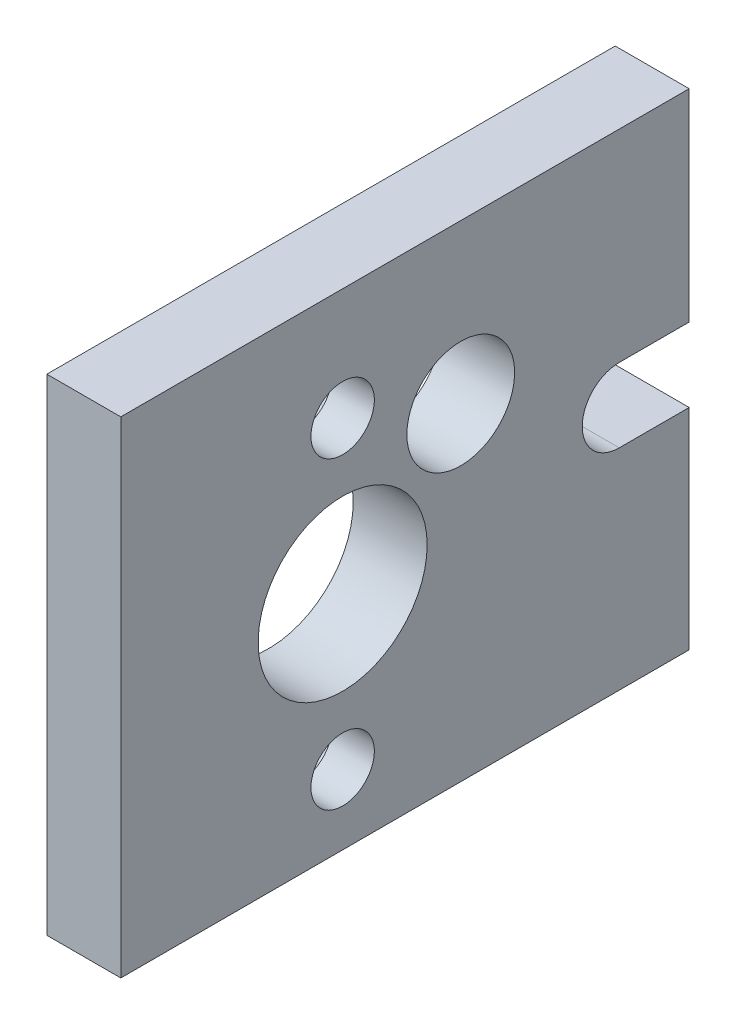
ISO-10303-21;
HEADER;
FILE_DESCRIPTION(('STEP AP214'),'2;1');
FILE_NAME('part.step','',(''),(''),'','','');
FILE_SCHEMA(('AUTOMOTIVE_DESIGN { 1 0 10303 214 1 1 1 1 }'));
ENDSEC;
DATA;
#1=APPLICATION_CONTEXT('core data for automotive mechanical design processes');
#2=APPLICATION_PROTOCOL_DEFINITION('international standard','automotive_design',2000,#1);
#3=PRODUCT_CONTEXT('',#1,'mechanical');
#4=PRODUCT('Part','Part','',(#3));
#5=PRODUCT_RELATED_PRODUCT_CATEGORY('part','',(#4));
#6=PRODUCT_DEFINITION_FORMATION('','',#4);
#7=PRODUCT_DEFINITION_CONTEXT('part definition',#1,'design');
#8=PRODUCT_DEFINITION('design','',#6,#7);
#9=PRODUCT_DEFINITION_SHAPE('','',#8);
#10=(LENGTH_UNIT() NAMED_UNIT(*) SI_UNIT(.MILLI.,.METRE.));
#11=(NAMED_UNIT(*) PLANE_ANGLE_UNIT() SI_UNIT($,.RADIAN.));
#12=(NAMED_UNIT(*) SI_UNIT($,.STERADIAN.) SOLID_ANGLE_UNIT());
#13=UNCERTAINTY_MEASURE_WITH_UNIT(LENGTH_MEASURE(1.E-05),#10,'distance_accuracy_value','');
#14=(GEOMETRIC_REPRESENTATION_CONTEXT(3) GLOBAL_UNCERTAINTY_ASSIGNED_CONTEXT((#13)) GLOBAL_UNIT_ASSIGNED_CONTEXT((#10,
#11,#12)) REPRESENTATION_CONTEXT('',''));
#15=CARTESIAN_POINT('',(0.,0.,0.));
#16=DIRECTION('',(0.,0.,1.));
#17=DIRECTION('',(1.,0.,0.));
#18=AXIS2_PLACEMENT_3D('',#15,#16,#17);
#19=CARTESIAN_POINT('',(3.5,0.,10.5));
#20=DIRECTION('',(0.,0.,1.));
#21=DIRECTION('',(1.,0.,0.));
#22=AXIS2_PLACEMENT_3D('',#19,#20,#21);
#23=PLANE('',#22);
#24=DIRECTION('',(0.,1.,0.));
#25=VECTOR('',#24,1.);
#26=CARTESIAN_POINT('',(0.,0.,10.5));
#27=LINE('',#26,#25);
#28=CARTESIAN_POINT('',(0.,-10.5,10.5));
#29=VERTEX_POINT('',#28);
#30=CARTESIAN_POINT('',(0.,12.5,10.5));
#31=VERTEX_POINT('',#30);
#32=EDGE_CURVE('E127',#29,#31,#27,.T.);
#33=ORIENTED_EDGE('',*,*,#32,.F.);
#34=DIRECTION('',(-1.,0.,0.));
#35=VECTOR('',#34,1.);
#36=CARTESIAN_POINT('',(3.5,-10.5,10.5));
#37=LINE('',#36,#35);
#38=CARTESIAN_POINT('',(3.5,-10.5,10.5));
#39=VERTEX_POINT('',#38);
#40=EDGE_CURVE('E12',#39,#29,#37,.T.);
#41=ORIENTED_EDGE('',*,*,#40,.F.);
#42=DIRECTION('',(0.,1.,0.));
#43=VECTOR('',#42,1.);
#44=CARTESIAN_POINT('',(3.5,0.,10.5));
#45=LINE('',#44,#43);
#46=CARTESIAN_POINT('',(3.5,12.5,10.5));
#47=VERTEX_POINT('',#46);
#48=EDGE_CURVE('E198',#39,#47,#45,.T.);
#49=ORIENTED_EDGE('',*,*,#48,.T.);
#50=DIRECTION('',(-1.,0.,0.));
#51=VECTOR('',#50,1.);
#52=CARTESIAN_POINT('',(30.4742469774413,12.5,10.5));
#53=LINE('',#52,#51);
#54=EDGE_CURVE('E129',#47,#31,#53,.T.);
#55=ORIENTED_EDGE('',*,*,#54,.T.);
#56=EDGE_LOOP('',(#33,#41,#49,#55));
#57=FACE_BOUND('',#56,.T.);
#58=ADVANCED_FACE('F43',(#57),#23,.T.);
#59=CARTESIAN_POINT('',(3.5,-10.5,0.));
#60=DIRECTION('',(0.,-1.,0.));
#61=DIRECTION('',(0.,0.,-1.));
#62=AXIS2_PLACEMENT_3D('',#59,#60,#61);
#63=PLANE('',#62);
#64=DIRECTION('',(0.,0.,1.));
#65=VECTOR('',#64,1.);
#66=CARTESIAN_POINT('',(0.,-10.5,0.));
#67=LINE('',#66,#65);
#68=CARTESIAN_POINT('',(0.,-10.5,-16.4));
#69=VERTEX_POINT('',#68);
#70=EDGE_CURVE('E199',#69,#29,#67,.T.);
#71=ORIENTED_EDGE('',*,*,#70,.F.);
#72=DIRECTION('',(-1.,0.,0.));
#73=VECTOR('',#72,1.);
#74=CARTESIAN_POINT('',(25.3130694768068,-10.5,-16.4));
#75=LINE('',#74,#73);
#76=CARTESIAN_POINT('',(3.5,-10.5,-16.4));
#77=VERTEX_POINT('',#76);
#78=EDGE_CURVE('E148',#77,#69,#75,.T.);
#79=ORIENTED_EDGE('',*,*,#78,.F.);
#80=DIRECTION('',(0.,0.,1.));
#81=VECTOR('',#80,1.);
#82=CARTESIAN_POINT('',(3.5,-10.5,0.));
#83=LINE('',#82,#81);
#84=EDGE_CURVE('E52',#77,#39,#83,.T.);
#85=ORIENTED_EDGE('',*,*,#84,.T.);
#86=ORIENTED_EDGE('',*,*,#40,.T.);
#87=EDGE_LOOP('',(#71,#79,#85,#86));
#88=FACE_BOUND('',#87,.T.);
#89=ADVANCED_FACE('F209',(#88),#63,.T.);
#90=CARTESIAN_POINT('',(3.5,0.,0.));
#91=DIRECTION('',(-1.,0.,0.));
#92=DIRECTION('',(0.,0.,1.));
#93=AXIS2_PLACEMENT_3D('',#90,#91,#92);
#94=CYLINDRICAL_SURFACE('',#93,4.);
#95=CARTESIAN_POINT('',(3.5,0.,0.));
#96=DIRECTION('',(1.,0.,0.));
#97=DIRECTION('',(0.,0.,-1.));
#98=AXIS2_PLACEMENT_3D('',#95,#96,#97);
#99=CIRCLE('',#98,4.);
#100=CARTESIAN_POINT('',(3.5,0.,-4.));
#101=VERTEX_POINT('',#100);
#102=EDGE_CURVE('E195',#101,#101,#99,.T.);
#103=ORIENTED_EDGE('',*,*,#102,.T.);
#104=EDGE_LOOP('',(#103));
#105=FACE_BOUND('',#104,.T.);
#106=CARTESIAN_POINT('',(0.,0.,0.));
#107=DIRECTION('',(1.,0.,0.));
#108=DIRECTION('',(0.,0.,-1.));
#109=AXIS2_PLACEMENT_3D('',#106,#107,#108);
#110=CIRCLE('',#109,4.);
#111=CARTESIAN_POINT('',(0.,0.,-4.));
#112=VERTEX_POINT('',#111);
#113=EDGE_CURVE('E186',#112,#112,#110,.T.);
#114=ORIENTED_EDGE('',*,*,#113,.F.);
#115=EDGE_LOOP('',(#114));
#116=FACE_BOUND('',#115,.T.);
#117=ADVANCED_FACE('F45',(#105,#116),#94,.F.);
#118=CARTESIAN_POINT('',(3.5,0.,0.));
#119=DIRECTION('',(1.,0.,0.));
#120=DIRECTION('',(0.,0.,-1.));
#121=AXIS2_PLACEMENT_3D('',#118,#119,#120);
#122=PLANE('',#121);
#123=CARTESIAN_POINT('',(3.5,5.,-5.59016994374948));
#124=DIRECTION('',(-1.,0.,0.));
#125=DIRECTION('',(0.,0.,1.));
#126=AXIS2_PLACEMENT_3D('',#123,#124,#125);
#127=CIRCLE('',#126,2.55);
#128=CARTESIAN_POINT('',(3.5,5.,-3.04016994374948));
#129=VERTEX_POINT('',#128);
#130=EDGE_CURVE('E165',#129,#129,#127,.T.);
#131=ORIENTED_EDGE('',*,*,#130,.T.);
#132=EDGE_LOOP('',(#131));
#133=FACE_BOUND('',#132,.T.);
#134=CARTESIAN_POINT('',(3.5,-7.2,0.));
#135=DIRECTION('',(-1.,0.,0.));
#136=DIRECTION('',(0.,0.,1.));
#137=AXIS2_PLACEMENT_3D('',#134,#135,#136);
#138=CIRCLE('',#137,1.5);
#139=CARTESIAN_POINT('',(3.5,-7.2,1.5));
#140=VERTEX_POINT('',#139);
#141=EDGE_CURVE('E171',#140,#140,#138,.T.);
#142=ORIENTED_EDGE('',*,*,#141,.T.);
#143=EDGE_LOOP('',(#142));
#144=FACE_BOUND('',#143,.T.);
#145=CARTESIAN_POINT('',(3.5,7.2,0.));
#146=DIRECTION('',(-1.,0.,0.));
#147=DIRECTION('',(0.,0.,1.));
#148=AXIS2_PLACEMENT_3D('',#145,#146,#147);
#149=CIRCLE('',#148,1.5);
#150=CARTESIAN_POINT('',(3.5,7.2,1.5));
#151=VERTEX_POINT('',#150);
#152=EDGE_CURVE('E168',#151,#151,#149,.T.);
#153=ORIENTED_EDGE('',*,*,#152,.T.);
#154=EDGE_LOOP('',(#153));
#155=FACE_BOUND('',#154,.T.);
#156=ORIENTED_EDGE('',*,*,#102,.F.);
#157=EDGE_LOOP('',(#156));
#158=FACE_BOUND('',#157,.T.);
#159=ORIENTED_EDGE('',*,*,#48,.F.);
#160=ORIENTED_EDGE('',*,*,#84,.F.);
#161=DIRECTION('',(0.,-1.,0.));
#162=VECTOR('',#161,1.);
#163=CARTESIAN_POINT('',(3.5,0.,-16.4));
#164=LINE('',#163,#162);
#165=CARTESIAN_POINT('',(3.5,-0.565658985540006,-16.4));
#166=VERTEX_POINT('',#165);
#167=EDGE_CURVE('E145',#166,#77,#164,.T.);
#168=ORIENTED_EDGE('',*,*,#167,.F.);
#169=DIRECTION('',(0.,0.,1.));
#170=VECTOR('',#169,1.);
#171=CARTESIAN_POINT('',(3.5,-0.565658985540002,0.));
#172=LINE('',#171,#170);
#173=CARTESIAN_POINT('',(3.5,-0.565658985540006,-13.0901699437505));
#174=VERTEX_POINT('',#173);
#175=EDGE_CURVE('E134',#166,#174,#172,.T.);
#176=ORIENTED_EDGE('',*,*,#175,.T.);
#177=CARTESIAN_POINT('',(3.5,1.18434101445999,-13.0901699437505));
#178=DIRECTION('',(1.,0.,0.));
#179=DIRECTION('',(0.,0.,-1.));
#180=AXIS2_PLACEMENT_3D('',#177,#178,#179);
#181=CIRCLE('',#180,1.75);
#182=CARTESIAN_POINT('',(3.5,2.93434101445999,-13.0901699437505));
#183=VERTEX_POINT('',#182);
#184=EDGE_CURVE('E153',#174,#183,#181,.F.);
#185=ORIENTED_EDGE('',*,*,#184,.T.);
#186=DIRECTION('',(0.,0.,1.));
#187=VECTOR('',#186,1.);
#188=CARTESIAN_POINT('',(3.5,2.93434101446,0.));
#189=LINE('',#188,#187);
#190=CARTESIAN_POINT('',(3.5,2.93434101445999,-16.4));
#191=VERTEX_POINT('',#190);
#192=EDGE_CURVE('E144',#191,#183,#189,.T.);
#193=ORIENTED_EDGE('',*,*,#192,.F.);
#194=DIRECTION('',(0.,-1.,0.));
#195=VECTOR('',#194,1.);
#196=CARTESIAN_POINT('',(3.5,0.,-16.4));
#197=LINE('',#196,#195);
#198=CARTESIAN_POINT('',(3.5,12.5,-16.4));
#199=VERTEX_POINT('',#198);
#200=EDGE_CURVE('E149',#199,#191,#197,.T.);
#201=ORIENTED_EDGE('',*,*,#200,.F.);
#202=DIRECTION('',(0.,0.,-1.));
#203=VECTOR('',#202,1.);
#204=CARTESIAN_POINT('',(3.5,12.5,-16.4));
#205=LINE('',#204,#203);
#206=EDGE_CURVE('E122',#47,#199,#205,.T.);
#207=ORIENTED_EDGE('',*,*,#206,.F.);
#208=EDGE_LOOP('',(#159,#160,#168,#176,#185,#193,#201,#207));
#209=FACE_BOUND('',#208,.T.);
#210=ADVANCED_FACE('F215',(#133,#144,#155,#158,#209),#122,.T.);
#211=CARTESIAN_POINT('',(0.,0.,0.));
#212=DIRECTION('',(1.,0.,0.));
#213=DIRECTION('',(0.,0.,-1.));
#214=AXIS2_PLACEMENT_3D('',#211,#212,#213);
#215=PLANE('',#214);
#216=CARTESIAN_POINT('',(0.,5.,-5.59016994374948));
#217=DIRECTION('',(-1.,0.,0.));
#218=DIRECTION('',(0.,0.,1.));
#219=AXIS2_PLACEMENT_3D('',#216,#217,#218);
#220=CIRCLE('',#219,2.55);
#221=CARTESIAN_POINT('',(0.,5.,-3.04016994374948));
#222=VERTEX_POINT('',#221);
#223=EDGE_CURVE('E156',#222,#222,#220,.T.);
#224=ORIENTED_EDGE('',*,*,#223,.F.);
#225=EDGE_LOOP('',(#224));
#226=FACE_BOUND('',#225,.T.);
#227=CARTESIAN_POINT('',(0.,7.2,0.));
#228=DIRECTION('',(-1.,0.,0.));
#229=DIRECTION('',(0.,0.,1.));
#230=AXIS2_PLACEMENT_3D('',#227,#228,#229);
#231=CIRCLE('',#230,2.25);
#232=CARTESIAN_POINT('',(0.,7.2,2.25));
#233=VERTEX_POINT('',#232);
#234=EDGE_CURVE('E183',#233,#233,#231,.T.);
#235=ORIENTED_EDGE('',*,*,#234,.F.);
#236=EDGE_LOOP('',(#235));
#237=FACE_BOUND('',#236,.T.);
#238=CARTESIAN_POINT('',(0.,-7.2,0.));
#239=DIRECTION('',(-1.,0.,0.));
#240=DIRECTION('',(0.,0.,1.));
#241=AXIS2_PLACEMENT_3D('',#238,#239,#240);
#242=CIRCLE('',#241,2.25);
#243=CARTESIAN_POINT('',(0.,-7.2,2.25));
#244=VERTEX_POINT('',#243);
#245=EDGE_CURVE('E182',#244,#244,#242,.T.);
#246=ORIENTED_EDGE('',*,*,#245,.F.);
#247=EDGE_LOOP('',(#246));
#248=FACE_BOUND('',#247,.T.);
#249=ORIENTED_EDGE('',*,*,#113,.T.);
#250=EDGE_LOOP('',(#249));
#251=FACE_BOUND('',#250,.T.);
#252=ORIENTED_EDGE('',*,*,#32,.T.);
#253=DIRECTION('',(0.,0.,-1.));
#254=VECTOR('',#253,1.);
#255=CARTESIAN_POINT('',(0.,12.5,-16.4));
#256=LINE('',#255,#254);
#257=CARTESIAN_POINT('',(0.,12.5,-16.4));
#258=VERTEX_POINT('',#257);
#259=EDGE_CURVE('E120',#31,#258,#256,.T.);
#260=ORIENTED_EDGE('',*,*,#259,.T.);
#261=DIRECTION('',(0.,-1.,0.));
#262=VECTOR('',#261,1.);
#263=CARTESIAN_POINT('',(0.,0.,-16.4));
#264=LINE('',#263,#262);
#265=CARTESIAN_POINT('',(0.,2.93434101445999,-16.4));
#266=VERTEX_POINT('',#265);
#267=EDGE_CURVE('E102',#258,#266,#264,.T.);
#268=ORIENTED_EDGE('',*,*,#267,.T.);
#269=DIRECTION('',(0.,0.,1.));
#270=VECTOR('',#269,1.);
#271=CARTESIAN_POINT('',(0.,2.93434101446,0.));
#272=LINE('',#271,#270);
#273=CARTESIAN_POINT('',(0.,2.93434101445999,-13.0901699437505));
#274=VERTEX_POINT('',#273);
#275=EDGE_CURVE('E113',#266,#274,#272,.T.);
#276=ORIENTED_EDGE('',*,*,#275,.T.);
#277=CARTESIAN_POINT('',(0.,1.18434101445999,-13.0901699437505));
#278=DIRECTION('',(-1.,0.,0.));
#279=DIRECTION('',(0.,0.,1.));
#280=AXIS2_PLACEMENT_3D('',#277,#278,#279);
#281=CIRCLE('',#280,1.75);
#282=CARTESIAN_POINT('',(0.,-0.565658985540006,-13.0901699437505));
#283=VERTEX_POINT('',#282);
#284=EDGE_CURVE('E141',#283,#274,#281,.T.);
#285=ORIENTED_EDGE('',*,*,#284,.F.);
#286=DIRECTION('',(0.,0.,1.));
#287=VECTOR('',#286,1.);
#288=CARTESIAN_POINT('',(0.,-0.565658985540002,0.));
#289=LINE('',#288,#287);
#290=CARTESIAN_POINT('',(0.,-0.565658985540006,-16.4));
#291=VERTEX_POINT('',#290);
#292=EDGE_CURVE('E137',#291,#283,#289,.T.);
#293=ORIENTED_EDGE('',*,*,#292,.F.);
#294=EDGE_CURVE('E114',#291,#69,#264,.T.);
#295=ORIENTED_EDGE('',*,*,#294,.T.);
#296=ORIENTED_EDGE('',*,*,#70,.T.);
#297=EDGE_LOOP('',(#252,#260,#268,#276,#285,#293,#295,#296));
#298=FACE_BOUND('',#297,.T.);
#299=ADVANCED_FACE('F125',(#226,#237,#248,#251,#298),#215,.F.);
#300=CARTESIAN_POINT('',(9.86396103067893,-7.2,0.));
#301=DIRECTION('',(-1.,0.,0.));
#302=DIRECTION('',(0.,0.,1.));
#303=AXIS2_PLACEMENT_3D('',#300,#301,#302);
#304=CYLINDRICAL_SURFACE('',#303,2.25);
#305=ORIENTED_EDGE('',*,*,#245,.T.);
#306=EDGE_LOOP('',(#305));
#307=FACE_BOUND('',#306,.T.);
#308=CARTESIAN_POINT('',(1.5,-7.2,0.));
#309=DIRECTION('',(1.,0.,0.));
#310=DIRECTION('',(0.,0.,-1.));
#311=AXIS2_PLACEMENT_3D('',#308,#309,#310);
#312=CIRCLE('',#311,2.25);
#313=CARTESIAN_POINT('',(1.5,-7.2,-2.25));
#314=VERTEX_POINT('',#313);
#315=EDGE_CURVE('E190',#314,#314,#312,.F.);
#316=ORIENTED_EDGE('',*,*,#315,.F.);
#317=EDGE_LOOP('',(#316));
#318=FACE_BOUND('',#317,.T.);
#319=ADVANCED_FACE('F225',(#307,#318),#304,.F.);
#320=CARTESIAN_POINT('',(1.5,0.,0.));
#321=DIRECTION('',(1.,0.,0.));
#322=DIRECTION('',(0.,0.,-1.));
#323=AXIS2_PLACEMENT_3D('',#320,#321,#322);
#324=PLANE('',#323);
#325=ORIENTED_EDGE('',*,*,#315,.T.);
#326=EDGE_LOOP('',(#325));
#327=FACE_BOUND('',#326,.T.);
#328=CARTESIAN_POINT('',(1.5,-7.2,0.));
#329=DIRECTION('',(1.,0.,0.));
#330=DIRECTION('',(0.,0.,-1.));
#331=AXIS2_PLACEMENT_3D('',#328,#329,#330);
#332=CIRCLE('',#331,1.5);
#333=CARTESIAN_POINT('',(1.5,-7.2,-1.5));
#334=VERTEX_POINT('',#333);
#335=EDGE_CURVE('E179',#334,#334,#332,.T.);
#336=ORIENTED_EDGE('',*,*,#335,.T.);
#337=EDGE_LOOP('',(#336));
#338=FACE_BOUND('',#337,.T.);
#339=ADVANCED_FACE('F232',(#327,#338),#324,.F.);
#340=CARTESIAN_POINT('',(9.86396103067893,7.2,0.));
#341=DIRECTION('',(-1.,0.,0.));
#342=DIRECTION('',(0.,0.,1.));
#343=AXIS2_PLACEMENT_3D('',#340,#341,#342);
#344=CYLINDRICAL_SURFACE('',#343,2.25);
#345=ORIENTED_EDGE('',*,*,#234,.T.);
#346=EDGE_LOOP('',(#345));
#347=FACE_BOUND('',#346,.T.);
#348=CARTESIAN_POINT('',(1.5,7.2,0.));
#349=DIRECTION('',(1.,0.,0.));
#350=DIRECTION('',(0.,0.,-1.));
#351=AXIS2_PLACEMENT_3D('',#348,#349,#350);
#352=CIRCLE('',#351,2.25);
#353=CARTESIAN_POINT('',(1.5,7.2,-2.25));
#354=VERTEX_POINT('',#353);
#355=EDGE_CURVE('E187',#354,#354,#352,.F.);
#356=ORIENTED_EDGE('',*,*,#355,.F.);
#357=EDGE_LOOP('',(#356));
#358=FACE_BOUND('',#357,.T.);
#359=ADVANCED_FACE('F236',(#347,#358),#344,.F.);
#360=CARTESIAN_POINT('',(1.5,0.,0.));
#361=DIRECTION('',(1.,0.,0.));
#362=DIRECTION('',(0.,0.,-1.));
#363=AXIS2_PLACEMENT_3D('',#360,#361,#362);
#364=PLANE('',#363);
#365=ORIENTED_EDGE('',*,*,#355,.T.);
#366=EDGE_LOOP('',(#365));
#367=FACE_BOUND('',#366,.T.);
#368=CARTESIAN_POINT('',(1.5,7.2,0.));
#369=DIRECTION('',(1.,0.,0.));
#370=DIRECTION('',(0.,0.,-1.));
#371=AXIS2_PLACEMENT_3D('',#368,#369,#370);
#372=CIRCLE('',#371,1.5);
#373=CARTESIAN_POINT('',(1.5,7.2,-1.5));
#374=VERTEX_POINT('',#373);
#375=EDGE_CURVE('E174',#374,#374,#372,.T.);
#376=ORIENTED_EDGE('',*,*,#375,.T.);
#377=EDGE_LOOP('',(#376));
#378=FACE_BOUND('',#377,.T.);
#379=ADVANCED_FACE('F238',(#367,#378),#364,.F.);
#380=CARTESIAN_POINT('',(3.5,7.2,0.));
#381=DIRECTION('',(-1.,0.,0.));
#382=DIRECTION('',(0.,0.,1.));
#383=AXIS2_PLACEMENT_3D('',#380,#381,#382);
#384=CYLINDRICAL_SURFACE('',#383,1.5);
#385=ORIENTED_EDGE('',*,*,#152,.F.);
#386=EDGE_LOOP('',(#385));
#387=FACE_BOUND('',#386,.T.);
#388=ORIENTED_EDGE('',*,*,#375,.F.);
#389=EDGE_LOOP('',(#388));
#390=FACE_BOUND('',#389,.T.);
#391=ADVANCED_FACE('F241',(#387,#390),#384,.F.);
#392=CARTESIAN_POINT('',(3.5,-7.2,0.));
#393=DIRECTION('',(-1.,0.,0.));
#394=DIRECTION('',(0.,0.,1.));
#395=AXIS2_PLACEMENT_3D('',#392,#393,#394);
#396=CYLINDRICAL_SURFACE('',#395,1.5);
#397=ORIENTED_EDGE('',*,*,#141,.F.);
#398=EDGE_LOOP('',(#397));
#399=FACE_BOUND('',#398,.T.);
#400=ORIENTED_EDGE('',*,*,#335,.F.);
#401=EDGE_LOOP('',(#400));
#402=FACE_BOUND('',#401,.T.);
#403=ADVANCED_FACE('F248',(#399,#402),#396,.F.);
#404=CARTESIAN_POINT('',(3.5,5.,-5.59016994374948));
#405=DIRECTION('',(-1.,0.,0.));
#406=DIRECTION('',(0.,0.,1.));
#407=AXIS2_PLACEMENT_3D('',#404,#405,#406);
#408=CYLINDRICAL_SURFACE('',#407,2.55);
#409=ORIENTED_EDGE('',*,*,#130,.F.);
#410=EDGE_LOOP('',(#409));
#411=FACE_BOUND('',#410,.T.);
#412=ORIENTED_EDGE('',*,*,#223,.T.);
#413=EDGE_LOOP('',(#412));
#414=FACE_BOUND('',#413,.T.);
#415=ADVANCED_FACE('F252',(#411,#414),#408,.F.);
#416=CARTESIAN_POINT('',(25.3130694768068,1.18434101445999,-13.0901699437505));
#417=DIRECTION('',(-1.,0.,0.));
#418=DIRECTION('',(0.,0.,1.));
#419=AXIS2_PLACEMENT_3D('',#416,#417,#418);
#420=CYLINDRICAL_SURFACE('',#419,1.75);
#421=ORIENTED_EDGE('',*,*,#184,.F.);
#422=DIRECTION('',(-1.,0.,0.));
#423=VECTOR('',#422,1.);
#424=CARTESIAN_POINT('',(25.3130694768068,-0.565658985540006,-13.0901699437505));
#425=LINE('',#424,#423);
#426=EDGE_CURVE('E123',#174,#283,#425,.T.);
#427=ORIENTED_EDGE('',*,*,#426,.T.);
#428=ORIENTED_EDGE('',*,*,#284,.T.);
#429=DIRECTION('',(-1.,0.,0.));
#430=VECTOR('',#429,1.);
#431=CARTESIAN_POINT('',(25.3130694768068,2.93434101445999,-13.0901699437505));
#432=LINE('',#431,#430);
#433=EDGE_CURVE('E151',#183,#274,#432,.T.);
#434=ORIENTED_EDGE('',*,*,#433,.F.);
#435=EDGE_LOOP('',(#421,#427,#428,#434));
#436=FACE_BOUND('',#435,.T.);
#437=ADVANCED_FACE('F255',(#436),#420,.F.);
#438=CARTESIAN_POINT('',(25.3130694768068,2.93434101446,0.));
#439=DIRECTION('',(0.,-1.,0.));
#440=DIRECTION('',(0.,0.,-1.));
#441=AXIS2_PLACEMENT_3D('',#438,#439,#440);
#442=PLANE('',#441);
#443=DIRECTION('',(-1.,0.,0.));
#444=VECTOR('',#443,1.);
#445=CARTESIAN_POINT('',(25.3130694768068,2.93434101445999,-16.4));
#446=LINE('',#445,#444);
#447=EDGE_CURVE('E108',#191,#266,#446,.T.);
#448=ORIENTED_EDGE('',*,*,#447,.F.);
#449=ORIENTED_EDGE('',*,*,#192,.T.);
#450=ORIENTED_EDGE('',*,*,#433,.T.);
#451=ORIENTED_EDGE('',*,*,#275,.F.);
#452=EDGE_LOOP('',(#448,#449,#450,#451));
#453=FACE_BOUND('',#452,.T.);
#454=ADVANCED_FACE('F259',(#453),#442,.T.);
#455=CARTESIAN_POINT('',(25.3130694768068,0.,-16.4));
#456=DIRECTION('',(0.,0.,-1.));
#457=DIRECTION('',(0.,1.,0.));
#458=AXIS2_PLACEMENT_3D('',#455,#456,#457);
#459=PLANE('',#458);
#460=ORIENTED_EDGE('',*,*,#267,.F.);
#461=DIRECTION('',(-1.,0.,0.));
#462=VECTOR('',#461,1.);
#463=CARTESIAN_POINT('',(30.4742469774413,12.5,-16.4));
#464=LINE('',#463,#462);
#465=EDGE_CURVE('E105',#199,#258,#464,.T.);
#466=ORIENTED_EDGE('',*,*,#465,.F.);
#467=ORIENTED_EDGE('',*,*,#200,.T.);
#468=ORIENTED_EDGE('',*,*,#447,.T.);
#469=EDGE_LOOP('',(#460,#466,#467,#468));
#470=FACE_BOUND('',#469,.T.);
#471=ADVANCED_FACE('F104',(#470),#459,.T.);
#472=DIRECTION('',(-1.,0.,0.));
#473=VECTOR('',#472,1.);
#474=CARTESIAN_POINT('',(25.3130694768068,-0.565658985540006,-16.4));
#475=LINE('',#474,#473);
#476=EDGE_CURVE('E140',#166,#291,#475,.T.);
#477=ORIENTED_EDGE('',*,*,#476,.F.);
#478=ORIENTED_EDGE('',*,*,#167,.T.);
#479=ORIENTED_EDGE('',*,*,#78,.T.);
#480=ORIENTED_EDGE('',*,*,#294,.F.);
#481=EDGE_LOOP('',(#477,#478,#479,#480));
#482=FACE_BOUND('',#481,.T.);
#483=ADVANCED_FACE('F211',(#482),#459,.T.);
#484=CARTESIAN_POINT('',(25.3130694768068,-0.565658985540002,0.));
#485=DIRECTION('',(0.,-1.,0.));
#486=DIRECTION('',(0.,0.,-1.));
#487=AXIS2_PLACEMENT_3D('',#484,#485,#486);
#488=PLANE('',#487);
#489=ORIENTED_EDGE('',*,*,#175,.F.);
#490=ORIENTED_EDGE('',*,*,#476,.T.);
#491=ORIENTED_EDGE('',*,*,#292,.T.);
#492=ORIENTED_EDGE('',*,*,#426,.F.);
#493=EDGE_LOOP('',(#489,#490,#491,#492));
#494=FACE_BOUND('',#493,.T.);
#495=ADVANCED_FACE('F266',(#494),#488,.F.);
#496=CARTESIAN_POINT('',(30.4742469774413,12.5,-16.4));
#497=DIRECTION('',(0.,1.,0.));
#498=DIRECTION('',(0.,0.,1.));
#499=AXIS2_PLACEMENT_3D('',#496,#497,#498);
#500=PLANE('',#499);
#501=ORIENTED_EDGE('',*,*,#54,.F.);
#502=ORIENTED_EDGE('',*,*,#206,.T.);
#503=ORIENTED_EDGE('',*,*,#465,.T.);
#504=ORIENTED_EDGE('',*,*,#259,.F.);
#505=EDGE_LOOP('',(#501,#502,#503,#504));
#506=FACE_BOUND('',#505,.T.);
#507=ADVANCED_FACE('F119',(#506),#500,.T.);
#508=CLOSED_SHELL('',(#58,#89,#117,#210,#299,#319,#339,#359,#379,#391,#403,#415,#437,#454,#471,
#483,#495,#507));
#509=MANIFOLD_SOLID_BREP('B2',#508);
#510=ADVANCED_BREP_SHAPE_REPRESENTATION('',(#18,#509),#14);
#511=SHAPE_DEFINITION_REPRESENTATION(#9,#510);
ENDSEC;
END-ISO-10303-21;
